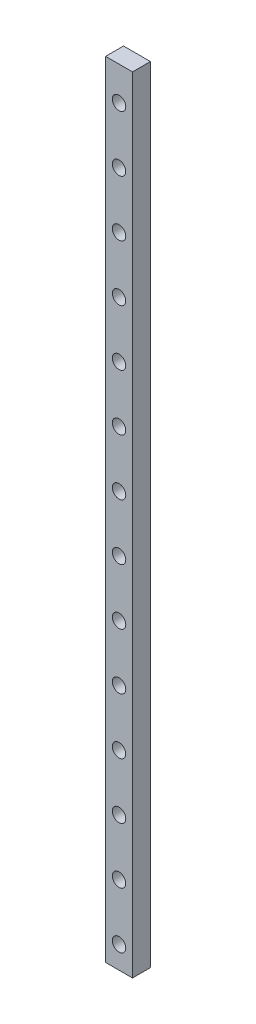
ISO-10303-21;
HEADER;
FILE_DESCRIPTION(('STEP AP214'),'2;1');
FILE_NAME('part.step','',(''),(''),'','','');
FILE_SCHEMA(('AUTOMOTIVE_DESIGN { 1 0 10303 214 1 1 1 1 }'));
ENDSEC;
DATA;
#1=APPLICATION_CONTEXT('core data for automotive mechanical design processes');
#2=APPLICATION_PROTOCOL_DEFINITION('international standard','automotive_design',2000,#1);
#3=PRODUCT_CONTEXT('',#1,'mechanical');
#4=PRODUCT('Part','Part','',(#3));
#5=PRODUCT_RELATED_PRODUCT_CATEGORY('part','',(#4));
#6=PRODUCT_DEFINITION_FORMATION('','',#4);
#7=PRODUCT_DEFINITION_CONTEXT('part definition',#1,'design');
#8=PRODUCT_DEFINITION('design','',#6,#7);
#9=PRODUCT_DEFINITION_SHAPE('','',#8);
#10=(LENGTH_UNIT() NAMED_UNIT(*) SI_UNIT(.MILLI.,.METRE.));
#11=(NAMED_UNIT(*) PLANE_ANGLE_UNIT() SI_UNIT($,.RADIAN.));
#12=(NAMED_UNIT(*) SI_UNIT($,.STERADIAN.) SOLID_ANGLE_UNIT());
#13=UNCERTAINTY_MEASURE_WITH_UNIT(LENGTH_MEASURE(1.E-05),#10,'distance_accuracy_value','');
#14=(GEOMETRIC_REPRESENTATION_CONTEXT(3) GLOBAL_UNCERTAINTY_ASSIGNED_CONTEXT((#13)) GLOBAL_UNIT_ASSIGNED_CONTEXT((#10,
#11,#12)) REPRESENTATION_CONTEXT('',''));
#15=CARTESIAN_POINT('',(0.,0.,0.));
#16=DIRECTION('',(0.,0.,1.));
#17=DIRECTION('',(1.,0.,0.));
#18=AXIS2_PLACEMENT_3D('',#15,#16,#17);
#19=CARTESIAN_POINT('',(-6.,350.,4.));
#20=DIRECTION('',(1.,0.,0.));
#21=DIRECTION('',(0.,0.,-1.));
#22=AXIS2_PLACEMENT_3D('',#19,#20,#21);
#23=PLANE('',#22);
#24=DIRECTION('',(0.,0.,1.));
#25=VECTOR('',#24,1.);
#26=CARTESIAN_POINT('',(-6.,0.,4.));
#27=LINE('',#26,#25);
#28=CARTESIAN_POINT('',(-6.,0.,-4.));
#29=VERTEX_POINT('',#28);
#30=CARTESIAN_POINT('',(-6.,0.,4.));
#31=VERTEX_POINT('',#30);
#32=EDGE_CURVE('E104',#29,#31,#27,.T.);
#33=ORIENTED_EDGE('',*,*,#32,.T.);
#34=DIRECTION('',(0.,-1.,0.));
#35=VECTOR('',#34,1.);
#36=CARTESIAN_POINT('',(-6.,350.,4.));
#37=LINE('',#36,#35);
#38=CARTESIAN_POINT('',(-6.,350.,4.));
#39=VERTEX_POINT('',#38);
#40=EDGE_CURVE('E11',#39,#31,#37,.T.);
#41=ORIENTED_EDGE('',*,*,#40,.F.);
#42=DIRECTION('',(0.,0.,1.));
#43=VECTOR('',#42,1.);
#44=CARTESIAN_POINT('',(-6.,350.,4.));
#45=LINE('',#44,#43);
#46=CARTESIAN_POINT('',(-6.,350.,-4.));
#47=VERTEX_POINT('',#46);
#48=EDGE_CURVE('E91',#47,#39,#45,.T.);
#49=ORIENTED_EDGE('',*,*,#48,.F.);
#50=DIRECTION('',(0.,-1.,0.));
#51=VECTOR('',#50,1.);
#52=CARTESIAN_POINT('',(-6.,350.,-4.));
#53=LINE('',#52,#51);
#54=EDGE_CURVE('E100',#47,#29,#53,.T.);
#55=ORIENTED_EDGE('',*,*,#54,.T.);
#56=EDGE_LOOP('',(#33,#41,#49,#55));
#57=FACE_BOUND('',#56,.T.);
#58=ADVANCED_FACE('F39',(#57),#23,.F.);
#59=CARTESIAN_POINT('',(6.,350.,4.));
#60=DIRECTION('',(0.,0.,-1.));
#61=DIRECTION('',(-1.,0.,0.));
#62=AXIS2_PLACEMENT_3D('',#59,#60,#61);
#63=PLANE('',#62);
#64=CARTESIAN_POINT('',(0.,335.,4.));
#65=DIRECTION('',(0.,0.,1.));
#66=DIRECTION('',(1.,0.,0.));
#67=AXIS2_PLACEMENT_3D('',#64,#65,#66);
#68=CIRCLE('',#67,3.);
#69=CARTESIAN_POINT('',(3.,335.,4.));
#70=VERTEX_POINT('',#69);
#71=EDGE_CURVE('E276',#70,#70,#68,.T.);
#72=ORIENTED_EDGE('',*,*,#71,.F.);
#73=EDGE_LOOP('',(#72));
#74=FACE_BOUND('',#73,.T.);
#75=CARTESIAN_POINT('',(0.,310.,4.));
#76=DIRECTION('',(0.,0.,1.));
#77=DIRECTION('',(1.,0.,0.));
#78=AXIS2_PLACEMENT_3D('',#75,#76,#77);
#79=CIRCLE('',#78,3.);
#80=CARTESIAN_POINT('',(3.,310.,4.));
#81=VERTEX_POINT('',#80);
#82=EDGE_CURVE('E264',#81,#81,#79,.T.);
#83=ORIENTED_EDGE('',*,*,#82,.F.);
#84=EDGE_LOOP('',(#83));
#85=FACE_BOUND('',#84,.T.);
#86=CARTESIAN_POINT('',(0.,285.,4.));
#87=DIRECTION('',(0.,0.,1.));
#88=DIRECTION('',(1.,0.,0.));
#89=AXIS2_PLACEMENT_3D('',#86,#87,#88);
#90=CIRCLE('',#89,3.);
#91=CARTESIAN_POINT('',(3.,285.,4.));
#92=VERTEX_POINT('',#91);
#93=EDGE_CURVE('E252',#92,#92,#90,.T.);
#94=ORIENTED_EDGE('',*,*,#93,.F.);
#95=EDGE_LOOP('',(#94));
#96=FACE_BOUND('',#95,.T.);
#97=CARTESIAN_POINT('',(0.,260.,4.));
#98=DIRECTION('',(0.,0.,1.));
#99=DIRECTION('',(1.,0.,0.));
#100=AXIS2_PLACEMENT_3D('',#97,#98,#99);
#101=CIRCLE('',#100,3.);
#102=CARTESIAN_POINT('',(3.,260.,4.));
#103=VERTEX_POINT('',#102);
#104=EDGE_CURVE('E240',#103,#103,#101,.T.);
#105=ORIENTED_EDGE('',*,*,#104,.F.);
#106=EDGE_LOOP('',(#105));
#107=FACE_BOUND('',#106,.T.);
#108=CARTESIAN_POINT('',(0.,235.,4.));
#109=DIRECTION('',(0.,0.,1.));
#110=DIRECTION('',(1.,0.,0.));
#111=AXIS2_PLACEMENT_3D('',#108,#109,#110);
#112=CIRCLE('',#111,3.);
#113=CARTESIAN_POINT('',(3.,235.,4.));
#114=VERTEX_POINT('',#113);
#115=EDGE_CURVE('E228',#114,#114,#112,.T.);
#116=ORIENTED_EDGE('',*,*,#115,.F.);
#117=EDGE_LOOP('',(#116));
#118=FACE_BOUND('',#117,.T.);
#119=CARTESIAN_POINT('',(0.,210.,4.));
#120=DIRECTION('',(0.,0.,1.));
#121=DIRECTION('',(1.,0.,0.));
#122=AXIS2_PLACEMENT_3D('',#119,#120,#121);
#123=CIRCLE('',#122,3.);
#124=CARTESIAN_POINT('',(3.,210.,4.));
#125=VERTEX_POINT('',#124);
#126=EDGE_CURVE('E216',#125,#125,#123,.T.);
#127=ORIENTED_EDGE('',*,*,#126,.F.);
#128=EDGE_LOOP('',(#127));
#129=FACE_BOUND('',#128,.T.);
#130=CARTESIAN_POINT('',(0.,185.,4.));
#131=DIRECTION('',(0.,0.,1.));
#132=DIRECTION('',(1.,0.,0.));
#133=AXIS2_PLACEMENT_3D('',#130,#131,#132);
#134=CIRCLE('',#133,3.);
#135=CARTESIAN_POINT('',(3.,185.,4.));
#136=VERTEX_POINT('',#135);
#137=EDGE_CURVE('E204',#136,#136,#134,.T.);
#138=ORIENTED_EDGE('',*,*,#137,.F.);
#139=EDGE_LOOP('',(#138));
#140=FACE_BOUND('',#139,.T.);
#141=CARTESIAN_POINT('',(0.,160.,4.));
#142=DIRECTION('',(0.,0.,1.));
#143=DIRECTION('',(1.,0.,0.));
#144=AXIS2_PLACEMENT_3D('',#141,#142,#143);
#145=CIRCLE('',#144,3.);
#146=CARTESIAN_POINT('',(3.,160.,4.));
#147=VERTEX_POINT('',#146);
#148=EDGE_CURVE('E192',#147,#147,#145,.T.);
#149=ORIENTED_EDGE('',*,*,#148,.F.);
#150=EDGE_LOOP('',(#149));
#151=FACE_BOUND('',#150,.T.);
#152=CARTESIAN_POINT('',(0.,135.,4.));
#153=DIRECTION('',(0.,0.,1.));
#154=DIRECTION('',(1.,0.,0.));
#155=AXIS2_PLACEMENT_3D('',#152,#153,#154);
#156=CIRCLE('',#155,3.);
#157=CARTESIAN_POINT('',(3.,135.,4.));
#158=VERTEX_POINT('',#157);
#159=EDGE_CURVE('E180',#158,#158,#156,.T.);
#160=ORIENTED_EDGE('',*,*,#159,.F.);
#161=EDGE_LOOP('',(#160));
#162=FACE_BOUND('',#161,.T.);
#163=CARTESIAN_POINT('',(0.,110.,4.));
#164=DIRECTION('',(0.,0.,1.));
#165=DIRECTION('',(1.,0.,0.));
#166=AXIS2_PLACEMENT_3D('',#163,#164,#165);
#167=CIRCLE('',#166,3.);
#168=CARTESIAN_POINT('',(3.,110.,4.));
#169=VERTEX_POINT('',#168);
#170=EDGE_CURVE('E168',#169,#169,#167,.T.);
#171=ORIENTED_EDGE('',*,*,#170,.F.);
#172=EDGE_LOOP('',(#171));
#173=FACE_BOUND('',#172,.T.);
#174=CARTESIAN_POINT('',(0.,85.,4.));
#175=DIRECTION('',(0.,0.,1.));
#176=DIRECTION('',(1.,0.,0.));
#177=AXIS2_PLACEMENT_3D('',#174,#175,#176);
#178=CIRCLE('',#177,3.);
#179=CARTESIAN_POINT('',(3.,85.,4.));
#180=VERTEX_POINT('',#179);
#181=EDGE_CURVE('E156',#180,#180,#178,.T.);
#182=ORIENTED_EDGE('',*,*,#181,.F.);
#183=EDGE_LOOP('',(#182));
#184=FACE_BOUND('',#183,.T.);
#185=CARTESIAN_POINT('',(0.,60.,4.));
#186=DIRECTION('',(0.,0.,1.));
#187=DIRECTION('',(1.,0.,0.));
#188=AXIS2_PLACEMENT_3D('',#185,#186,#187);
#189=CIRCLE('',#188,3.);
#190=CARTESIAN_POINT('',(3.,60.,4.));
#191=VERTEX_POINT('',#190);
#192=EDGE_CURVE('E144',#191,#191,#189,.T.);
#193=ORIENTED_EDGE('',*,*,#192,.F.);
#194=EDGE_LOOP('',(#193));
#195=FACE_BOUND('',#194,.T.);
#196=CARTESIAN_POINT('',(0.,35.,4.));
#197=DIRECTION('',(0.,0.,1.));
#198=DIRECTION('',(1.,0.,0.));
#199=AXIS2_PLACEMENT_3D('',#196,#197,#198);
#200=CIRCLE('',#199,3.);
#201=CARTESIAN_POINT('',(3.,35.,4.));
#202=VERTEX_POINT('',#201);
#203=EDGE_CURVE('E132',#202,#202,#200,.T.);
#204=ORIENTED_EDGE('',*,*,#203,.F.);
#205=EDGE_LOOP('',(#204));
#206=FACE_BOUND('',#205,.T.);
#207=CARTESIAN_POINT('',(0.,10.,4.));
#208=DIRECTION('',(0.,0.,1.));
#209=DIRECTION('',(1.,0.,0.));
#210=AXIS2_PLACEMENT_3D('',#207,#208,#209);
#211=CIRCLE('',#210,3.);
#212=CARTESIAN_POINT('',(3.,10.,4.));
#213=VERTEX_POINT('',#212);
#214=EDGE_CURVE('E118',#213,#213,#211,.T.);
#215=ORIENTED_EDGE('',*,*,#214,.F.);
#216=EDGE_LOOP('',(#215));
#217=FACE_BOUND('',#216,.T.);
#218=DIRECTION('',(1.,0.,0.));
#219=VECTOR('',#218,1.);
#220=CARTESIAN_POINT('',(6.,0.,4.));
#221=LINE('',#220,#219);
#222=CARTESIAN_POINT('',(6.,0.,4.));
#223=VERTEX_POINT('',#222);
#224=EDGE_CURVE('E95',#31,#223,#221,.T.);
#225=ORIENTED_EDGE('',*,*,#224,.T.);
#226=DIRECTION('',(0.,-1.,0.));
#227=VECTOR('',#226,1.);
#228=CARTESIAN_POINT('',(6.,350.,4.));
#229=LINE('',#228,#227);
#230=CARTESIAN_POINT('',(6.,350.,4.));
#231=VERTEX_POINT('',#230);
#232=EDGE_CURVE('E48',#231,#223,#229,.T.);
#233=ORIENTED_EDGE('',*,*,#232,.F.);
#234=DIRECTION('',(1.,0.,0.));
#235=VECTOR('',#234,1.);
#236=CARTESIAN_POINT('',(6.,350.,4.));
#237=LINE('',#236,#235);
#238=EDGE_CURVE('E86',#39,#231,#237,.T.);
#239=ORIENTED_EDGE('',*,*,#238,.F.);
#240=ORIENTED_EDGE('',*,*,#40,.T.);
#241=EDGE_LOOP('',(#225,#233,#239,#240));
#242=FACE_BOUND('',#241,.T.);
#243=ADVANCED_FACE('F94',(#74,#85,#96,#107,#118,#129,#140,#151,#162,#173,#184,#195,#206,#217,
#242),#63,.F.);
#244=CARTESIAN_POINT('',(6.,350.,4.));
#245=DIRECTION('',(-1.,0.,0.));
#246=DIRECTION('',(0.,0.,1.));
#247=AXIS2_PLACEMENT_3D('',#244,#245,#246);
#248=PLANE('',#247);
#249=DIRECTION('',(0.,0.,-1.));
#250=VECTOR('',#249,1.);
#251=CARTESIAN_POINT('',(6.,0.,4.));
#252=LINE('',#251,#250);
#253=CARTESIAN_POINT('',(6.,0.,-4.));
#254=VERTEX_POINT('',#253);
#255=EDGE_CURVE('E73',#223,#254,#252,.T.);
#256=ORIENTED_EDGE('',*,*,#255,.T.);
#257=DIRECTION('',(0.,-1.,0.));
#258=VECTOR('',#257,1.);
#259=CARTESIAN_POINT('',(6.,350.,-4.));
#260=LINE('',#259,#258);
#261=CARTESIAN_POINT('',(6.,350.,-4.));
#262=VERTEX_POINT('',#261);
#263=EDGE_CURVE('E96',#262,#254,#260,.T.);
#264=ORIENTED_EDGE('',*,*,#263,.F.);
#265=DIRECTION('',(0.,0.,-1.));
#266=VECTOR('',#265,1.);
#267=CARTESIAN_POINT('',(6.,350.,4.));
#268=LINE('',#267,#266);
#269=EDGE_CURVE('E89',#231,#262,#268,.T.);
#270=ORIENTED_EDGE('',*,*,#269,.F.);
#271=ORIENTED_EDGE('',*,*,#232,.T.);
#272=EDGE_LOOP('',(#256,#264,#270,#271));
#273=FACE_BOUND('',#272,.T.);
#274=ADVANCED_FACE('F98',(#273),#248,.F.);
#275=CARTESIAN_POINT('',(6.,350.,-4.));
#276=DIRECTION('',(0.,0.,1.));
#277=DIRECTION('',(1.,0.,0.));
#278=AXIS2_PLACEMENT_3D('',#275,#276,#277);
#279=PLANE('',#278);
#280=CARTESIAN_POINT('',(0.,335.,-4.));
#281=DIRECTION('',(0.,0.,1.));
#282=DIRECTION('',(1.,0.,0.));
#283=AXIS2_PLACEMENT_3D('',#280,#281,#282);
#284=CIRCLE('',#283,1.75);
#285=CARTESIAN_POINT('',(1.75,335.,-4.));
#286=VERTEX_POINT('',#285);
#287=EDGE_CURVE('E279',#286,#286,#284,.T.);
#288=ORIENTED_EDGE('',*,*,#287,.T.);
#289=EDGE_LOOP('',(#288));
#290=FACE_BOUND('',#289,.T.);
#291=CARTESIAN_POINT('',(0.,310.,-4.));
#292=DIRECTION('',(0.,0.,1.));
#293=DIRECTION('',(1.,0.,0.));
#294=AXIS2_PLACEMENT_3D('',#291,#292,#293);
#295=CIRCLE('',#294,1.75);
#296=CARTESIAN_POINT('',(1.75,310.,-4.));
#297=VERTEX_POINT('',#296);
#298=EDGE_CURVE('E267',#297,#297,#295,.T.);
#299=ORIENTED_EDGE('',*,*,#298,.T.);
#300=EDGE_LOOP('',(#299));
#301=FACE_BOUND('',#300,.T.);
#302=CARTESIAN_POINT('',(0.,285.,-4.));
#303=DIRECTION('',(0.,0.,1.));
#304=DIRECTION('',(1.,0.,0.));
#305=AXIS2_PLACEMENT_3D('',#302,#303,#304);
#306=CIRCLE('',#305,1.75);
#307=CARTESIAN_POINT('',(1.75,285.,-4.));
#308=VERTEX_POINT('',#307);
#309=EDGE_CURVE('E255',#308,#308,#306,.T.);
#310=ORIENTED_EDGE('',*,*,#309,.T.);
#311=EDGE_LOOP('',(#310));
#312=FACE_BOUND('',#311,.T.);
#313=CARTESIAN_POINT('',(0.,260.,-4.));
#314=DIRECTION('',(0.,0.,1.));
#315=DIRECTION('',(1.,0.,0.));
#316=AXIS2_PLACEMENT_3D('',#313,#314,#315);
#317=CIRCLE('',#316,1.75);
#318=CARTESIAN_POINT('',(1.75,260.,-4.));
#319=VERTEX_POINT('',#318);
#320=EDGE_CURVE('E243',#319,#319,#317,.T.);
#321=ORIENTED_EDGE('',*,*,#320,.T.);
#322=EDGE_LOOP('',(#321));
#323=FACE_BOUND('',#322,.T.);
#324=CARTESIAN_POINT('',(0.,235.,-4.));
#325=DIRECTION('',(0.,0.,1.));
#326=DIRECTION('',(1.,0.,0.));
#327=AXIS2_PLACEMENT_3D('',#324,#325,#326);
#328=CIRCLE('',#327,1.75);
#329=CARTESIAN_POINT('',(1.75,235.,-4.));
#330=VERTEX_POINT('',#329);
#331=EDGE_CURVE('E231',#330,#330,#328,.T.);
#332=ORIENTED_EDGE('',*,*,#331,.T.);
#333=EDGE_LOOP('',(#332));
#334=FACE_BOUND('',#333,.T.);
#335=CARTESIAN_POINT('',(0.,210.,-4.));
#336=DIRECTION('',(0.,0.,1.));
#337=DIRECTION('',(1.,0.,0.));
#338=AXIS2_PLACEMENT_3D('',#335,#336,#337);
#339=CIRCLE('',#338,1.75);
#340=CARTESIAN_POINT('',(1.75,210.,-4.));
#341=VERTEX_POINT('',#340);
#342=EDGE_CURVE('E219',#341,#341,#339,.T.);
#343=ORIENTED_EDGE('',*,*,#342,.T.);
#344=EDGE_LOOP('',(#343));
#345=FACE_BOUND('',#344,.T.);
#346=CARTESIAN_POINT('',(0.,185.,-4.));
#347=DIRECTION('',(0.,0.,1.));
#348=DIRECTION('',(1.,0.,0.));
#349=AXIS2_PLACEMENT_3D('',#346,#347,#348);
#350=CIRCLE('',#349,1.75);
#351=CARTESIAN_POINT('',(1.75,185.,-4.));
#352=VERTEX_POINT('',#351);
#353=EDGE_CURVE('E207',#352,#352,#350,.T.);
#354=ORIENTED_EDGE('',*,*,#353,.T.);
#355=EDGE_LOOP('',(#354));
#356=FACE_BOUND('',#355,.T.);
#357=CARTESIAN_POINT('',(0.,160.,-4.));
#358=DIRECTION('',(0.,0.,1.));
#359=DIRECTION('',(1.,0.,0.));
#360=AXIS2_PLACEMENT_3D('',#357,#358,#359);
#361=CIRCLE('',#360,1.75);
#362=CARTESIAN_POINT('',(1.75,160.,-4.));
#363=VERTEX_POINT('',#362);
#364=EDGE_CURVE('E195',#363,#363,#361,.T.);
#365=ORIENTED_EDGE('',*,*,#364,.T.);
#366=EDGE_LOOP('',(#365));
#367=FACE_BOUND('',#366,.T.);
#368=CARTESIAN_POINT('',(0.,135.,-4.));
#369=DIRECTION('',(0.,0.,1.));
#370=DIRECTION('',(1.,0.,0.));
#371=AXIS2_PLACEMENT_3D('',#368,#369,#370);
#372=CIRCLE('',#371,1.75);
#373=CARTESIAN_POINT('',(1.75,135.,-4.));
#374=VERTEX_POINT('',#373);
#375=EDGE_CURVE('E183',#374,#374,#372,.T.);
#376=ORIENTED_EDGE('',*,*,#375,.T.);
#377=EDGE_LOOP('',(#376));
#378=FACE_BOUND('',#377,.T.);
#379=CARTESIAN_POINT('',(0.,110.,-4.));
#380=DIRECTION('',(0.,0.,1.));
#381=DIRECTION('',(1.,0.,0.));
#382=AXIS2_PLACEMENT_3D('',#379,#380,#381);
#383=CIRCLE('',#382,1.75);
#384=CARTESIAN_POINT('',(1.75,110.,-4.));
#385=VERTEX_POINT('',#384);
#386=EDGE_CURVE('E171',#385,#385,#383,.T.);
#387=ORIENTED_EDGE('',*,*,#386,.T.);
#388=EDGE_LOOP('',(#387));
#389=FACE_BOUND('',#388,.T.);
#390=CARTESIAN_POINT('',(0.,85.,-4.));
#391=DIRECTION('',(0.,0.,1.));
#392=DIRECTION('',(1.,0.,0.));
#393=AXIS2_PLACEMENT_3D('',#390,#391,#392);
#394=CIRCLE('',#393,1.75);
#395=CARTESIAN_POINT('',(1.75,85.,-4.));
#396=VERTEX_POINT('',#395);
#397=EDGE_CURVE('E159',#396,#396,#394,.T.);
#398=ORIENTED_EDGE('',*,*,#397,.T.);
#399=EDGE_LOOP('',(#398));
#400=FACE_BOUND('',#399,.T.);
#401=CARTESIAN_POINT('',(0.,60.,-4.));
#402=DIRECTION('',(0.,0.,1.));
#403=DIRECTION('',(1.,0.,0.));
#404=AXIS2_PLACEMENT_3D('',#401,#402,#403);
#405=CIRCLE('',#404,1.75);
#406=CARTESIAN_POINT('',(1.75,60.,-4.));
#407=VERTEX_POINT('',#406);
#408=EDGE_CURVE('E147',#407,#407,#405,.T.);
#409=ORIENTED_EDGE('',*,*,#408,.T.);
#410=EDGE_LOOP('',(#409));
#411=FACE_BOUND('',#410,.T.);
#412=CARTESIAN_POINT('',(0.,35.,-4.));
#413=DIRECTION('',(0.,0.,1.));
#414=DIRECTION('',(1.,0.,0.));
#415=AXIS2_PLACEMENT_3D('',#412,#413,#414);
#416=CIRCLE('',#415,1.75);
#417=CARTESIAN_POINT('',(1.75,35.,-4.));
#418=VERTEX_POINT('',#417);
#419=EDGE_CURVE('E135',#418,#418,#416,.T.);
#420=ORIENTED_EDGE('',*,*,#419,.T.);
#421=EDGE_LOOP('',(#420));
#422=FACE_BOUND('',#421,.T.);
#423=CARTESIAN_POINT('',(0.,10.,-4.));
#424=DIRECTION('',(0.,0.,1.));
#425=DIRECTION('',(1.,0.,0.));
#426=AXIS2_PLACEMENT_3D('',#423,#424,#425);
#427=CIRCLE('',#426,1.75);
#428=CARTESIAN_POINT('',(1.75,10.,-4.));
#429=VERTEX_POINT('',#428);
#430=EDGE_CURVE('E42',#429,#429,#427,.T.);
#431=ORIENTED_EDGE('',*,*,#430,.T.);
#432=EDGE_LOOP('',(#431));
#433=FACE_BOUND('',#432,.T.);
#434=DIRECTION('',(-1.,0.,0.));
#435=VECTOR('',#434,1.);
#436=CARTESIAN_POINT('',(6.,0.,-4.));
#437=LINE('',#436,#435);
#438=EDGE_CURVE('E79',#254,#29,#437,.T.);
#439=ORIENTED_EDGE('',*,*,#438,.T.);
#440=ORIENTED_EDGE('',*,*,#54,.F.);
#441=DIRECTION('',(-1.,0.,0.));
#442=VECTOR('',#441,1.);
#443=CARTESIAN_POINT('',(6.,350.,-4.));
#444=LINE('',#443,#442);
#445=EDGE_CURVE('E56',#262,#47,#444,.T.);
#446=ORIENTED_EDGE('',*,*,#445,.F.);
#447=ORIENTED_EDGE('',*,*,#263,.T.);
#448=EDGE_LOOP('',(#439,#440,#446,#447));
#449=FACE_BOUND('',#448,.T.);
#450=ADVANCED_FACE('F112',(#290,#301,#312,#323,#334,#345,#356,#367,#378,#389,#400,#411,#422,
#433,#449),#279,.F.);
#451=CARTESIAN_POINT('',(0.,350.,0.));
#452=DIRECTION('',(0.,1.,0.));
#453=DIRECTION('',(0.,0.,1.));
#454=AXIS2_PLACEMENT_3D('',#451,#452,#453);
#455=PLANE('',#454);
#456=ORIENTED_EDGE('',*,*,#48,.T.);
#457=ORIENTED_EDGE('',*,*,#238,.T.);
#458=ORIENTED_EDGE('',*,*,#269,.T.);
#459=ORIENTED_EDGE('',*,*,#445,.T.);
#460=EDGE_LOOP('',(#456,#457,#458,#459));
#461=FACE_BOUND('',#460,.T.);
#462=ADVANCED_FACE('F87',(#461),#455,.T.);
#463=CARTESIAN_POINT('',(0.,0.,0.));
#464=DIRECTION('',(0.,1.,0.));
#465=DIRECTION('',(0.,0.,1.));
#466=AXIS2_PLACEMENT_3D('',#463,#464,#465);
#467=PLANE('',#466);
#468=ORIENTED_EDGE('',*,*,#32,.F.);
#469=ORIENTED_EDGE('',*,*,#438,.F.);
#470=ORIENTED_EDGE('',*,*,#255,.F.);
#471=ORIENTED_EDGE('',*,*,#224,.F.);
#472=EDGE_LOOP('',(#468,#469,#470,#471));
#473=FACE_BOUND('',#472,.T.);
#474=ADVANCED_FACE('F115',(#473),#467,.F.);
#475=CARTESIAN_POINT('',(0.,10.,-0.499999999999999));
#476=DIRECTION('',(0.,0.,1.));
#477=DIRECTION('',(1.,0.,0.));
#478=AXIS2_PLACEMENT_3D('',#475,#476,#477);
#479=CYLINDRICAL_SURFACE('',#478,3.);
#480=CARTESIAN_POINT('',(0.,10.,-0.499999999999999));
#481=DIRECTION('',(0.,0.,1.));
#482=DIRECTION('',(1.,0.,0.));
#483=AXIS2_PLACEMENT_3D('',#480,#481,#482);
#484=CIRCLE('',#483,3.);
#485=CARTESIAN_POINT('',(3.,10.,-0.499999999999999));
#486=VERTEX_POINT('',#485);
#487=EDGE_CURVE('E107',#486,#486,#484,.T.);
#488=ORIENTED_EDGE('',*,*,#487,.F.);
#489=EDGE_LOOP('',(#488));
#490=FACE_BOUND('',#489,.T.);
#491=ORIENTED_EDGE('',*,*,#214,.T.);
#492=EDGE_LOOP('',(#491));
#493=FACE_BOUND('',#492,.T.);
#494=ADVANCED_FACE('F313',(#490,#493),#479,.F.);
#495=CARTESIAN_POINT('',(0.,10.,-0.499999999999999));
#496=DIRECTION('',(0.,0.,1.));
#497=DIRECTION('',(1.,0.,0.));
#498=AXIS2_PLACEMENT_3D('',#495,#496,#497);
#499=PLANE('',#498);
#500=CARTESIAN_POINT('',(0.,10.,-0.499999999999999));
#501=DIRECTION('',(0.,0.,1.));
#502=DIRECTION('',(1.,0.,0.));
#503=AXIS2_PLACEMENT_3D('',#500,#501,#502);
#504=CIRCLE('',#503,1.75);
#505=CARTESIAN_POINT('',(1.75,10.,-0.499999999999999));
#506=VERTEX_POINT('',#505);
#507=EDGE_CURVE('E123',#506,#506,#504,.T.);
#508=ORIENTED_EDGE('',*,*,#507,.F.);
#509=EDGE_LOOP('',(#508));
#510=FACE_BOUND('',#509,.T.);
#511=ORIENTED_EDGE('',*,*,#487,.T.);
#512=EDGE_LOOP('',(#511));
#513=FACE_BOUND('',#512,.T.);
#514=ADVANCED_FACE('F318',(#510,#513),#499,.T.);
#515=CARTESIAN_POINT('',(0.,10.,-5.));
#516=DIRECTION('',(0.,0.,1.));
#517=DIRECTION('',(1.,0.,0.));
#518=AXIS2_PLACEMENT_3D('',#515,#516,#517);
#519=CYLINDRICAL_SURFACE('',#518,1.75);
#520=ORIENTED_EDGE('',*,*,#507,.T.);
#521=EDGE_LOOP('',(#520));
#522=FACE_BOUND('',#521,.T.);
#523=ORIENTED_EDGE('',*,*,#430,.F.);
#524=EDGE_LOOP('',(#523));
#525=FACE_BOUND('',#524,.T.);
#526=ADVANCED_FACE('F322',(#522,#525),#519,.F.);
#527=CARTESIAN_POINT('',(0.,35.,-0.499999999999999));
#528=DIRECTION('',(0.,0.,1.));
#529=DIRECTION('',(1.,0.,0.));
#530=AXIS2_PLACEMENT_3D('',#527,#528,#529);
#531=CYLINDRICAL_SURFACE('',#530,3.);
#532=CARTESIAN_POINT('',(0.,35.,-0.499999999999999));
#533=DIRECTION('',(0.,0.,1.));
#534=DIRECTION('',(1.,0.,0.));
#535=AXIS2_PLACEMENT_3D('',#532,#533,#534);
#536=CIRCLE('',#535,3.);
#537=CARTESIAN_POINT('',(3.,35.,-0.499999999999999));
#538=VERTEX_POINT('',#537);
#539=EDGE_CURVE('E126',#538,#538,#536,.T.);
#540=ORIENTED_EDGE('',*,*,#539,.F.);
#541=EDGE_LOOP('',(#540));
#542=FACE_BOUND('',#541,.T.);
#543=ORIENTED_EDGE('',*,*,#203,.T.);
#544=EDGE_LOOP('',(#543));
#545=FACE_BOUND('',#544,.T.);
#546=ADVANCED_FACE('F325',(#542,#545),#531,.F.);
#547=CARTESIAN_POINT('',(0.,35.,-0.499999999999999));
#548=DIRECTION('',(0.,0.,1.));
#549=DIRECTION('',(1.,0.,0.));
#550=AXIS2_PLACEMENT_3D('',#547,#548,#549);
#551=PLANE('',#550);
#552=CARTESIAN_POINT('',(0.,35.,-0.499999999999999));
#553=DIRECTION('',(0.,0.,1.));
#554=DIRECTION('',(1.,0.,0.));
#555=AXIS2_PLACEMENT_3D('',#552,#553,#554);
#556=CIRCLE('',#555,1.75);
#557=CARTESIAN_POINT('',(1.75,35.,-0.499999999999999));
#558=VERTEX_POINT('',#557);
#559=EDGE_CURVE('E129',#558,#558,#556,.T.);
#560=ORIENTED_EDGE('',*,*,#559,.F.);
#561=EDGE_LOOP('',(#560));
#562=FACE_BOUND('',#561,.T.);
#563=ORIENTED_EDGE('',*,*,#539,.T.);
#564=EDGE_LOOP('',(#563));
#565=FACE_BOUND('',#564,.T.);
#566=ADVANCED_FACE('F329',(#562,#565),#551,.T.);
#567=CARTESIAN_POINT('',(0.,35.,-5.));
#568=DIRECTION('',(0.,0.,1.));
#569=DIRECTION('',(1.,0.,0.));
#570=AXIS2_PLACEMENT_3D('',#567,#568,#569);
#571=CYLINDRICAL_SURFACE('',#570,1.75);
#572=ORIENTED_EDGE('',*,*,#559,.T.);
#573=EDGE_LOOP('',(#572));
#574=FACE_BOUND('',#573,.T.);
#575=ORIENTED_EDGE('',*,*,#419,.F.);
#576=EDGE_LOOP('',(#575));
#577=FACE_BOUND('',#576,.T.);
#578=ADVANCED_FACE('F333',(#574,#577),#571,.F.);
#579=CARTESIAN_POINT('',(0.,60.,-0.499999999999999));
#580=DIRECTION('',(0.,0.,1.));
#581=DIRECTION('',(1.,0.,0.));
#582=AXIS2_PLACEMENT_3D('',#579,#580,#581);
#583=CYLINDRICAL_SURFACE('',#582,3.);
#584=CARTESIAN_POINT('',(0.,60.,-0.499999999999999));
#585=DIRECTION('',(0.,0.,1.));
#586=DIRECTION('',(1.,0.,0.));
#587=AXIS2_PLACEMENT_3D('',#584,#585,#586);
#588=CIRCLE('',#587,3.);
#589=CARTESIAN_POINT('',(3.,60.,-0.499999999999999));
#590=VERTEX_POINT('',#589);
#591=EDGE_CURVE('E138',#590,#590,#588,.T.);
#592=ORIENTED_EDGE('',*,*,#591,.F.);
#593=EDGE_LOOP('',(#592));
#594=FACE_BOUND('',#593,.T.);
#595=ORIENTED_EDGE('',*,*,#192,.T.);
#596=EDGE_LOOP('',(#595));
#597=FACE_BOUND('',#596,.T.);
#598=ADVANCED_FACE('F337',(#594,#597),#583,.F.);
#599=CARTESIAN_POINT('',(0.,60.,-0.499999999999999));
#600=DIRECTION('',(0.,0.,1.));
#601=DIRECTION('',(1.,0.,0.));
#602=AXIS2_PLACEMENT_3D('',#599,#600,#601);
#603=PLANE('',#602);
#604=CARTESIAN_POINT('',(0.,60.,-0.499999999999999));
#605=DIRECTION('',(0.,0.,1.));
#606=DIRECTION('',(1.,0.,0.));
#607=AXIS2_PLACEMENT_3D('',#604,#605,#606);
#608=CIRCLE('',#607,1.75);
#609=CARTESIAN_POINT('',(1.75,60.,-0.499999999999999));
#610=VERTEX_POINT('',#609);
#611=EDGE_CURVE('E141',#610,#610,#608,.T.);
#612=ORIENTED_EDGE('',*,*,#611,.F.);
#613=EDGE_LOOP('',(#612));
#614=FACE_BOUND('',#613,.T.);
#615=ORIENTED_EDGE('',*,*,#591,.T.);
#616=EDGE_LOOP('',(#615));
#617=FACE_BOUND('',#616,.T.);
#618=ADVANCED_FACE('F341',(#614,#617),#603,.T.);
#619=CARTESIAN_POINT('',(0.,60.,-5.));
#620=DIRECTION('',(0.,0.,1.));
#621=DIRECTION('',(1.,0.,0.));
#622=AXIS2_PLACEMENT_3D('',#619,#620,#621);
#623=CYLINDRICAL_SURFACE('',#622,1.75);
#624=ORIENTED_EDGE('',*,*,#611,.T.);
#625=EDGE_LOOP('',(#624));
#626=FACE_BOUND('',#625,.T.);
#627=ORIENTED_EDGE('',*,*,#408,.F.);
#628=EDGE_LOOP('',(#627));
#629=FACE_BOUND('',#628,.T.);
#630=ADVANCED_FACE('F345',(#626,#629),#623,.F.);
#631=CARTESIAN_POINT('',(0.,85.,-0.499999999999999));
#632=DIRECTION('',(0.,0.,1.));
#633=DIRECTION('',(1.,0.,0.));
#634=AXIS2_PLACEMENT_3D('',#631,#632,#633);
#635=CYLINDRICAL_SURFACE('',#634,3.);
#636=CARTESIAN_POINT('',(0.,85.,-0.499999999999999));
#637=DIRECTION('',(0.,0.,1.));
#638=DIRECTION('',(1.,0.,0.));
#639=AXIS2_PLACEMENT_3D('',#636,#637,#638);
#640=CIRCLE('',#639,3.);
#641=CARTESIAN_POINT('',(3.,85.,-0.499999999999999));
#642=VERTEX_POINT('',#641);
#643=EDGE_CURVE('E150',#642,#642,#640,.T.);
#644=ORIENTED_EDGE('',*,*,#643,.F.);
#645=EDGE_LOOP('',(#644));
#646=FACE_BOUND('',#645,.T.);
#647=ORIENTED_EDGE('',*,*,#181,.T.);
#648=EDGE_LOOP('',(#647));
#649=FACE_BOUND('',#648,.T.);
#650=ADVANCED_FACE('F349',(#646,#649),#635,.F.);
#651=CARTESIAN_POINT('',(0.,85.,-0.499999999999999));
#652=DIRECTION('',(0.,0.,1.));
#653=DIRECTION('',(1.,0.,0.));
#654=AXIS2_PLACEMENT_3D('',#651,#652,#653);
#655=PLANE('',#654);
#656=CARTESIAN_POINT('',(0.,85.,-0.499999999999999));
#657=DIRECTION('',(0.,0.,1.));
#658=DIRECTION('',(1.,0.,0.));
#659=AXIS2_PLACEMENT_3D('',#656,#657,#658);
#660=CIRCLE('',#659,1.75);
#661=CARTESIAN_POINT('',(1.75,85.,-0.499999999999999));
#662=VERTEX_POINT('',#661);
#663=EDGE_CURVE('E153',#662,#662,#660,.T.);
#664=ORIENTED_EDGE('',*,*,#663,.F.);
#665=EDGE_LOOP('',(#664));
#666=FACE_BOUND('',#665,.T.);
#667=ORIENTED_EDGE('',*,*,#643,.T.);
#668=EDGE_LOOP('',(#667));
#669=FACE_BOUND('',#668,.T.);
#670=ADVANCED_FACE('F353',(#666,#669),#655,.T.);
#671=CARTESIAN_POINT('',(0.,85.,-5.));
#672=DIRECTION('',(0.,0.,1.));
#673=DIRECTION('',(1.,0.,0.));
#674=AXIS2_PLACEMENT_3D('',#671,#672,#673);
#675=CYLINDRICAL_SURFACE('',#674,1.75);
#676=ORIENTED_EDGE('',*,*,#663,.T.);
#677=EDGE_LOOP('',(#676));
#678=FACE_BOUND('',#677,.T.);
#679=ORIENTED_EDGE('',*,*,#397,.F.);
#680=EDGE_LOOP('',(#679));
#681=FACE_BOUND('',#680,.T.);
#682=ADVANCED_FACE('F357',(#678,#681),#675,.F.);
#683=CARTESIAN_POINT('',(0.,110.,-0.499999999999999));
#684=DIRECTION('',(0.,0.,1.));
#685=DIRECTION('',(1.,0.,0.));
#686=AXIS2_PLACEMENT_3D('',#683,#684,#685);
#687=CYLINDRICAL_SURFACE('',#686,3.);
#688=CARTESIAN_POINT('',(0.,110.,-0.499999999999999));
#689=DIRECTION('',(0.,0.,1.));
#690=DIRECTION('',(1.,0.,0.));
#691=AXIS2_PLACEMENT_3D('',#688,#689,#690);
#692=CIRCLE('',#691,3.);
#693=CARTESIAN_POINT('',(3.,110.,-0.499999999999999));
#694=VERTEX_POINT('',#693);
#695=EDGE_CURVE('E162',#694,#694,#692,.T.);
#696=ORIENTED_EDGE('',*,*,#695,.F.);
#697=EDGE_LOOP('',(#696));
#698=FACE_BOUND('',#697,.T.);
#699=ORIENTED_EDGE('',*,*,#170,.T.);
#700=EDGE_LOOP('',(#699));
#701=FACE_BOUND('',#700,.T.);
#702=ADVANCED_FACE('F361',(#698,#701),#687,.F.);
#703=CARTESIAN_POINT('',(0.,110.,-0.499999999999999));
#704=DIRECTION('',(0.,0.,1.));
#705=DIRECTION('',(1.,0.,0.));
#706=AXIS2_PLACEMENT_3D('',#703,#704,#705);
#707=PLANE('',#706);
#708=CARTESIAN_POINT('',(0.,110.,-0.499999999999999));
#709=DIRECTION('',(0.,0.,1.));
#710=DIRECTION('',(1.,0.,0.));
#711=AXIS2_PLACEMENT_3D('',#708,#709,#710);
#712=CIRCLE('',#711,1.75);
#713=CARTESIAN_POINT('',(1.75,110.,-0.499999999999999));
#714=VERTEX_POINT('',#713);
#715=EDGE_CURVE('E165',#714,#714,#712,.T.);
#716=ORIENTED_EDGE('',*,*,#715,.F.);
#717=EDGE_LOOP('',(#716));
#718=FACE_BOUND('',#717,.T.);
#719=ORIENTED_EDGE('',*,*,#695,.T.);
#720=EDGE_LOOP('',(#719));
#721=FACE_BOUND('',#720,.T.);
#722=ADVANCED_FACE('F365',(#718,#721),#707,.T.);
#723=CARTESIAN_POINT('',(0.,110.,-5.));
#724=DIRECTION('',(0.,0.,1.));
#725=DIRECTION('',(1.,0.,0.));
#726=AXIS2_PLACEMENT_3D('',#723,#724,#725);
#727=CYLINDRICAL_SURFACE('',#726,1.75);
#728=ORIENTED_EDGE('',*,*,#715,.T.);
#729=EDGE_LOOP('',(#728));
#730=FACE_BOUND('',#729,.T.);
#731=ORIENTED_EDGE('',*,*,#386,.F.);
#732=EDGE_LOOP('',(#731));
#733=FACE_BOUND('',#732,.T.);
#734=ADVANCED_FACE('F369',(#730,#733),#727,.F.);
#735=CARTESIAN_POINT('',(0.,135.,-0.499999999999999));
#736=DIRECTION('',(0.,0.,1.));
#737=DIRECTION('',(1.,0.,0.));
#738=AXIS2_PLACEMENT_3D('',#735,#736,#737);
#739=CYLINDRICAL_SURFACE('',#738,3.);
#740=CARTESIAN_POINT('',(0.,135.,-0.499999999999999));
#741=DIRECTION('',(0.,0.,1.));
#742=DIRECTION('',(1.,0.,0.));
#743=AXIS2_PLACEMENT_3D('',#740,#741,#742);
#744=CIRCLE('',#743,3.);
#745=CARTESIAN_POINT('',(3.,135.,-0.499999999999999));
#746=VERTEX_POINT('',#745);
#747=EDGE_CURVE('E174',#746,#746,#744,.T.);
#748=ORIENTED_EDGE('',*,*,#747,.F.);
#749=EDGE_LOOP('',(#748));
#750=FACE_BOUND('',#749,.T.);
#751=ORIENTED_EDGE('',*,*,#159,.T.);
#752=EDGE_LOOP('',(#751));
#753=FACE_BOUND('',#752,.T.);
#754=ADVANCED_FACE('F373',(#750,#753),#739,.F.);
#755=CARTESIAN_POINT('',(0.,135.,-0.499999999999999));
#756=DIRECTION('',(0.,0.,1.));
#757=DIRECTION('',(1.,0.,0.));
#758=AXIS2_PLACEMENT_3D('',#755,#756,#757);
#759=PLANE('',#758);
#760=CARTESIAN_POINT('',(0.,135.,-0.499999999999999));
#761=DIRECTION('',(0.,0.,1.));
#762=DIRECTION('',(1.,0.,0.));
#763=AXIS2_PLACEMENT_3D('',#760,#761,#762);
#764=CIRCLE('',#763,1.75);
#765=CARTESIAN_POINT('',(1.75,135.,-0.499999999999999));
#766=VERTEX_POINT('',#765);
#767=EDGE_CURVE('E177',#766,#766,#764,.T.);
#768=ORIENTED_EDGE('',*,*,#767,.F.);
#769=EDGE_LOOP('',(#768));
#770=FACE_BOUND('',#769,.T.);
#771=ORIENTED_EDGE('',*,*,#747,.T.);
#772=EDGE_LOOP('',(#771));
#773=FACE_BOUND('',#772,.T.);
#774=ADVANCED_FACE('F377',(#770,#773),#759,.T.);
#775=CARTESIAN_POINT('',(0.,135.,-5.));
#776=DIRECTION('',(0.,0.,1.));
#777=DIRECTION('',(1.,0.,0.));
#778=AXIS2_PLACEMENT_3D('',#775,#776,#777);
#779=CYLINDRICAL_SURFACE('',#778,1.75);
#780=ORIENTED_EDGE('',*,*,#767,.T.);
#781=EDGE_LOOP('',(#780));
#782=FACE_BOUND('',#781,.T.);
#783=ORIENTED_EDGE('',*,*,#375,.F.);
#784=EDGE_LOOP('',(#783));
#785=FACE_BOUND('',#784,.T.);
#786=ADVANCED_FACE('F381',(#782,#785),#779,.F.);
#787=CARTESIAN_POINT('',(0.,160.,-0.499999999999999));
#788=DIRECTION('',(0.,0.,1.));
#789=DIRECTION('',(1.,0.,0.));
#790=AXIS2_PLACEMENT_3D('',#787,#788,#789);
#791=CYLINDRICAL_SURFACE('',#790,3.);
#792=CARTESIAN_POINT('',(0.,160.,-0.499999999999999));
#793=DIRECTION('',(0.,0.,1.));
#794=DIRECTION('',(1.,0.,0.));
#795=AXIS2_PLACEMENT_3D('',#792,#793,#794);
#796=CIRCLE('',#795,3.);
#797=CARTESIAN_POINT('',(3.,160.,-0.499999999999999));
#798=VERTEX_POINT('',#797);
#799=EDGE_CURVE('E186',#798,#798,#796,.T.);
#800=ORIENTED_EDGE('',*,*,#799,.F.);
#801=EDGE_LOOP('',(#800));
#802=FACE_BOUND('',#801,.T.);
#803=ORIENTED_EDGE('',*,*,#148,.T.);
#804=EDGE_LOOP('',(#803));
#805=FACE_BOUND('',#804,.T.);
#806=ADVANCED_FACE('F385',(#802,#805),#791,.F.);
#807=CARTESIAN_POINT('',(0.,160.,-0.499999999999999));
#808=DIRECTION('',(0.,0.,1.));
#809=DIRECTION('',(1.,0.,0.));
#810=AXIS2_PLACEMENT_3D('',#807,#808,#809);
#811=PLANE('',#810);
#812=CARTESIAN_POINT('',(0.,160.,-0.499999999999999));
#813=DIRECTION('',(0.,0.,1.));
#814=DIRECTION('',(1.,0.,0.));
#815=AXIS2_PLACEMENT_3D('',#812,#813,#814);
#816=CIRCLE('',#815,1.75);
#817=CARTESIAN_POINT('',(1.75,160.,-0.499999999999999));
#818=VERTEX_POINT('',#817);
#819=EDGE_CURVE('E189',#818,#818,#816,.T.);
#820=ORIENTED_EDGE('',*,*,#819,.F.);
#821=EDGE_LOOP('',(#820));
#822=FACE_BOUND('',#821,.T.);
#823=ORIENTED_EDGE('',*,*,#799,.T.);
#824=EDGE_LOOP('',(#823));
#825=FACE_BOUND('',#824,.T.);
#826=ADVANCED_FACE('F389',(#822,#825),#811,.T.);
#827=CARTESIAN_POINT('',(0.,160.,-5.));
#828=DIRECTION('',(0.,0.,1.));
#829=DIRECTION('',(1.,0.,0.));
#830=AXIS2_PLACEMENT_3D('',#827,#828,#829);
#831=CYLINDRICAL_SURFACE('',#830,1.75);
#832=ORIENTED_EDGE('',*,*,#819,.T.);
#833=EDGE_LOOP('',(#832));
#834=FACE_BOUND('',#833,.T.);
#835=ORIENTED_EDGE('',*,*,#364,.F.);
#836=EDGE_LOOP('',(#835));
#837=FACE_BOUND('',#836,.T.);
#838=ADVANCED_FACE('F393',(#834,#837),#831,.F.);
#839=CARTESIAN_POINT('',(0.,185.,-0.499999999999999));
#840=DIRECTION('',(0.,0.,1.));
#841=DIRECTION('',(1.,0.,0.));
#842=AXIS2_PLACEMENT_3D('',#839,#840,#841);
#843=CYLINDRICAL_SURFACE('',#842,3.);
#844=CARTESIAN_POINT('',(0.,185.,-0.499999999999999));
#845=DIRECTION('',(0.,0.,1.));
#846=DIRECTION('',(1.,0.,0.));
#847=AXIS2_PLACEMENT_3D('',#844,#845,#846);
#848=CIRCLE('',#847,3.);
#849=CARTESIAN_POINT('',(3.,185.,-0.499999999999999));
#850=VERTEX_POINT('',#849);
#851=EDGE_CURVE('E198',#850,#850,#848,.T.);
#852=ORIENTED_EDGE('',*,*,#851,.F.);
#853=EDGE_LOOP('',(#852));
#854=FACE_BOUND('',#853,.T.);
#855=ORIENTED_EDGE('',*,*,#137,.T.);
#856=EDGE_LOOP('',(#855));
#857=FACE_BOUND('',#856,.T.);
#858=ADVANCED_FACE('F397',(#854,#857),#843,.F.);
#859=CARTESIAN_POINT('',(0.,185.,-0.499999999999999));
#860=DIRECTION('',(0.,0.,1.));
#861=DIRECTION('',(1.,0.,0.));
#862=AXIS2_PLACEMENT_3D('',#859,#860,#861);
#863=PLANE('',#862);
#864=CARTESIAN_POINT('',(0.,185.,-0.499999999999999));
#865=DIRECTION('',(0.,0.,1.));
#866=DIRECTION('',(1.,0.,0.));
#867=AXIS2_PLACEMENT_3D('',#864,#865,#866);
#868=CIRCLE('',#867,1.75);
#869=CARTESIAN_POINT('',(1.75,185.,-0.499999999999999));
#870=VERTEX_POINT('',#869);
#871=EDGE_CURVE('E201',#870,#870,#868,.T.);
#872=ORIENTED_EDGE('',*,*,#871,.F.);
#873=EDGE_LOOP('',(#872));
#874=FACE_BOUND('',#873,.T.);
#875=ORIENTED_EDGE('',*,*,#851,.T.);
#876=EDGE_LOOP('',(#875));
#877=FACE_BOUND('',#876,.T.);
#878=ADVANCED_FACE('F401',(#874,#877),#863,.T.);
#879=CARTESIAN_POINT('',(0.,185.,-5.));
#880=DIRECTION('',(0.,0.,1.));
#881=DIRECTION('',(1.,0.,0.));
#882=AXIS2_PLACEMENT_3D('',#879,#880,#881);
#883=CYLINDRICAL_SURFACE('',#882,1.75);
#884=ORIENTED_EDGE('',*,*,#871,.T.);
#885=EDGE_LOOP('',(#884));
#886=FACE_BOUND('',#885,.T.);
#887=ORIENTED_EDGE('',*,*,#353,.F.);
#888=EDGE_LOOP('',(#887));
#889=FACE_BOUND('',#888,.T.);
#890=ADVANCED_FACE('F405',(#886,#889),#883,.F.);
#891=CARTESIAN_POINT('',(0.,210.,-0.499999999999999));
#892=DIRECTION('',(0.,0.,1.));
#893=DIRECTION('',(1.,0.,0.));
#894=AXIS2_PLACEMENT_3D('',#891,#892,#893);
#895=CYLINDRICAL_SURFACE('',#894,3.);
#896=CARTESIAN_POINT('',(0.,210.,-0.499999999999999));
#897=DIRECTION('',(0.,0.,1.));
#898=DIRECTION('',(1.,0.,0.));
#899=AXIS2_PLACEMENT_3D('',#896,#897,#898);
#900=CIRCLE('',#899,3.);
#901=CARTESIAN_POINT('',(3.,210.,-0.499999999999999));
#902=VERTEX_POINT('',#901);
#903=EDGE_CURVE('E210',#902,#902,#900,.T.);
#904=ORIENTED_EDGE('',*,*,#903,.F.);
#905=EDGE_LOOP('',(#904));
#906=FACE_BOUND('',#905,.T.);
#907=ORIENTED_EDGE('',*,*,#126,.T.);
#908=EDGE_LOOP('',(#907));
#909=FACE_BOUND('',#908,.T.);
#910=ADVANCED_FACE('F409',(#906,#909),#895,.F.);
#911=CARTESIAN_POINT('',(0.,210.,-0.499999999999999));
#912=DIRECTION('',(0.,0.,1.));
#913=DIRECTION('',(1.,0.,0.));
#914=AXIS2_PLACEMENT_3D('',#911,#912,#913);
#915=PLANE('',#914);
#916=CARTESIAN_POINT('',(0.,210.,-0.499999999999999));
#917=DIRECTION('',(0.,0.,1.));
#918=DIRECTION('',(1.,0.,0.));
#919=AXIS2_PLACEMENT_3D('',#916,#917,#918);
#920=CIRCLE('',#919,1.75);
#921=CARTESIAN_POINT('',(1.75,210.,-0.499999999999999));
#922=VERTEX_POINT('',#921);
#923=EDGE_CURVE('E213',#922,#922,#920,.T.);
#924=ORIENTED_EDGE('',*,*,#923,.F.);
#925=EDGE_LOOP('',(#924));
#926=FACE_BOUND('',#925,.T.);
#927=ORIENTED_EDGE('',*,*,#903,.T.);
#928=EDGE_LOOP('',(#927));
#929=FACE_BOUND('',#928,.T.);
#930=ADVANCED_FACE('F413',(#926,#929),#915,.T.);
#931=CARTESIAN_POINT('',(0.,210.,-5.));
#932=DIRECTION('',(0.,0.,1.));
#933=DIRECTION('',(1.,0.,0.));
#934=AXIS2_PLACEMENT_3D('',#931,#932,#933);
#935=CYLINDRICAL_SURFACE('',#934,1.75);
#936=ORIENTED_EDGE('',*,*,#923,.T.);
#937=EDGE_LOOP('',(#936));
#938=FACE_BOUND('',#937,.T.);
#939=ORIENTED_EDGE('',*,*,#342,.F.);
#940=EDGE_LOOP('',(#939));
#941=FACE_BOUND('',#940,.T.);
#942=ADVANCED_FACE('F417',(#938,#941),#935,.F.);
#943=CARTESIAN_POINT('',(0.,235.,-0.499999999999999));
#944=DIRECTION('',(0.,0.,1.));
#945=DIRECTION('',(1.,0.,0.));
#946=AXIS2_PLACEMENT_3D('',#943,#944,#945);
#947=CYLINDRICAL_SURFACE('',#946,3.);
#948=CARTESIAN_POINT('',(0.,235.,-0.499999999999999));
#949=DIRECTION('',(0.,0.,1.));
#950=DIRECTION('',(1.,0.,0.));
#951=AXIS2_PLACEMENT_3D('',#948,#949,#950);
#952=CIRCLE('',#951,3.);
#953=CARTESIAN_POINT('',(3.,235.,-0.499999999999999));
#954=VERTEX_POINT('',#953);
#955=EDGE_CURVE('E222',#954,#954,#952,.T.);
#956=ORIENTED_EDGE('',*,*,#955,.F.);
#957=EDGE_LOOP('',(#956));
#958=FACE_BOUND('',#957,.T.);
#959=ORIENTED_EDGE('',*,*,#115,.T.);
#960=EDGE_LOOP('',(#959));
#961=FACE_BOUND('',#960,.T.);
#962=ADVANCED_FACE('F421',(#958,#961),#947,.F.);
#963=CARTESIAN_POINT('',(0.,235.,-0.499999999999999));
#964=DIRECTION('',(0.,0.,1.));
#965=DIRECTION('',(1.,0.,0.));
#966=AXIS2_PLACEMENT_3D('',#963,#964,#965);
#967=PLANE('',#966);
#968=CARTESIAN_POINT('',(0.,235.,-0.499999999999999));
#969=DIRECTION('',(0.,0.,1.));
#970=DIRECTION('',(1.,0.,0.));
#971=AXIS2_PLACEMENT_3D('',#968,#969,#970);
#972=CIRCLE('',#971,1.75);
#973=CARTESIAN_POINT('',(1.75,235.,-0.499999999999999));
#974=VERTEX_POINT('',#973);
#975=EDGE_CURVE('E225',#974,#974,#972,.T.);
#976=ORIENTED_EDGE('',*,*,#975,.F.);
#977=EDGE_LOOP('',(#976));
#978=FACE_BOUND('',#977,.T.);
#979=ORIENTED_EDGE('',*,*,#955,.T.);
#980=EDGE_LOOP('',(#979));
#981=FACE_BOUND('',#980,.T.);
#982=ADVANCED_FACE('F425',(#978,#981),#967,.T.);
#983=CARTESIAN_POINT('',(0.,235.,-5.));
#984=DIRECTION('',(0.,0.,1.));
#985=DIRECTION('',(1.,0.,0.));
#986=AXIS2_PLACEMENT_3D('',#983,#984,#985);
#987=CYLINDRICAL_SURFACE('',#986,1.75);
#988=ORIENTED_EDGE('',*,*,#975,.T.);
#989=EDGE_LOOP('',(#988));
#990=FACE_BOUND('',#989,.T.);
#991=ORIENTED_EDGE('',*,*,#331,.F.);
#992=EDGE_LOOP('',(#991));
#993=FACE_BOUND('',#992,.T.);
#994=ADVANCED_FACE('F429',(#990,#993),#987,.F.);
#995=CARTESIAN_POINT('',(0.,260.,-0.499999999999999));
#996=DIRECTION('',(0.,0.,1.));
#997=DIRECTION('',(1.,0.,0.));
#998=AXIS2_PLACEMENT_3D('',#995,#996,#997);
#999=CYLINDRICAL_SURFACE('',#998,3.);
#1000=CARTESIAN_POINT('',(0.,260.,-0.499999999999999));
#1001=DIRECTION('',(0.,0.,1.));
#1002=DIRECTION('',(1.,0.,0.));
#1003=AXIS2_PLACEMENT_3D('',#1000,#1001,#1002);
#1004=CIRCLE('',#1003,3.);
#1005=CARTESIAN_POINT('',(3.,260.,-0.499999999999999));
#1006=VERTEX_POINT('',#1005);
#1007=EDGE_CURVE('E234',#1006,#1006,#1004,.T.);
#1008=ORIENTED_EDGE('',*,*,#1007,.F.);
#1009=EDGE_LOOP('',(#1008));
#1010=FACE_BOUND('',#1009,.T.);
#1011=ORIENTED_EDGE('',*,*,#104,.T.);
#1012=EDGE_LOOP('',(#1011));
#1013=FACE_BOUND('',#1012,.T.);
#1014=ADVANCED_FACE('F433',(#1010,#1013),#999,.F.);
#1015=CARTESIAN_POINT('',(0.,260.,-0.499999999999999));
#1016=DIRECTION('',(0.,0.,1.));
#1017=DIRECTION('',(1.,0.,0.));
#1018=AXIS2_PLACEMENT_3D('',#1015,#1016,#1017);
#1019=PLANE('',#1018);
#1020=CARTESIAN_POINT('',(0.,260.,-0.499999999999999));
#1021=DIRECTION('',(0.,0.,1.));
#1022=DIRECTION('',(1.,0.,0.));
#1023=AXIS2_PLACEMENT_3D('',#1020,#1021,#1022);
#1024=CIRCLE('',#1023,1.75);
#1025=CARTESIAN_POINT('',(1.75,260.,-0.499999999999999));
#1026=VERTEX_POINT('',#1025);
#1027=EDGE_CURVE('E237',#1026,#1026,#1024,.T.);
#1028=ORIENTED_EDGE('',*,*,#1027,.F.);
#1029=EDGE_LOOP('',(#1028));
#1030=FACE_BOUND('',#1029,.T.);
#1031=ORIENTED_EDGE('',*,*,#1007,.T.);
#1032=EDGE_LOOP('',(#1031));
#1033=FACE_BOUND('',#1032,.T.);
#1034=ADVANCED_FACE('F437',(#1030,#1033),#1019,.T.);
#1035=CARTESIAN_POINT('',(0.,260.,-5.));
#1036=DIRECTION('',(0.,0.,1.));
#1037=DIRECTION('',(1.,0.,0.));
#1038=AXIS2_PLACEMENT_3D('',#1035,#1036,#1037);
#1039=CYLINDRICAL_SURFACE('',#1038,1.75);
#1040=ORIENTED_EDGE('',*,*,#1027,.T.);
#1041=EDGE_LOOP('',(#1040));
#1042=FACE_BOUND('',#1041,.T.);
#1043=ORIENTED_EDGE('',*,*,#320,.F.);
#1044=EDGE_LOOP('',(#1043));
#1045=FACE_BOUND('',#1044,.T.);
#1046=ADVANCED_FACE('F441',(#1042,#1045),#1039,.F.);
#1047=CARTESIAN_POINT('',(0.,285.,-0.499999999999999));
#1048=DIRECTION('',(0.,0.,1.));
#1049=DIRECTION('',(1.,0.,0.));
#1050=AXIS2_PLACEMENT_3D('',#1047,#1048,#1049);
#1051=CYLINDRICAL_SURFACE('',#1050,3.);
#1052=CARTESIAN_POINT('',(0.,285.,-0.499999999999999));
#1053=DIRECTION('',(0.,0.,1.));
#1054=DIRECTION('',(1.,0.,0.));
#1055=AXIS2_PLACEMENT_3D('',#1052,#1053,#1054);
#1056=CIRCLE('',#1055,3.);
#1057=CARTESIAN_POINT('',(3.,285.,-0.499999999999999));
#1058=VERTEX_POINT('',#1057);
#1059=EDGE_CURVE('E246',#1058,#1058,#1056,.T.);
#1060=ORIENTED_EDGE('',*,*,#1059,.F.);
#1061=EDGE_LOOP('',(#1060));
#1062=FACE_BOUND('',#1061,.T.);
#1063=ORIENTED_EDGE('',*,*,#93,.T.);
#1064=EDGE_LOOP('',(#1063));
#1065=FACE_BOUND('',#1064,.T.);
#1066=ADVANCED_FACE('F445',(#1062,#1065),#1051,.F.);
#1067=CARTESIAN_POINT('',(0.,285.,-0.499999999999999));
#1068=DIRECTION('',(0.,0.,1.));
#1069=DIRECTION('',(1.,0.,0.));
#1070=AXIS2_PLACEMENT_3D('',#1067,#1068,#1069);
#1071=PLANE('',#1070);
#1072=CARTESIAN_POINT('',(0.,285.,-0.499999999999999));
#1073=DIRECTION('',(0.,0.,1.));
#1074=DIRECTION('',(1.,0.,0.));
#1075=AXIS2_PLACEMENT_3D('',#1072,#1073,#1074);
#1076=CIRCLE('',#1075,1.75);
#1077=CARTESIAN_POINT('',(1.75,285.,-0.499999999999999));
#1078=VERTEX_POINT('',#1077);
#1079=EDGE_CURVE('E249',#1078,#1078,#1076,.T.);
#1080=ORIENTED_EDGE('',*,*,#1079,.F.);
#1081=EDGE_LOOP('',(#1080));
#1082=FACE_BOUND('',#1081,.T.);
#1083=ORIENTED_EDGE('',*,*,#1059,.T.);
#1084=EDGE_LOOP('',(#1083));
#1085=FACE_BOUND('',#1084,.T.);
#1086=ADVANCED_FACE('F449',(#1082,#1085),#1071,.T.);
#1087=CARTESIAN_POINT('',(0.,285.,-5.));
#1088=DIRECTION('',(0.,0.,1.));
#1089=DIRECTION('',(1.,0.,0.));
#1090=AXIS2_PLACEMENT_3D('',#1087,#1088,#1089);
#1091=CYLINDRICAL_SURFACE('',#1090,1.75);
#1092=ORIENTED_EDGE('',*,*,#1079,.T.);
#1093=EDGE_LOOP('',(#1092));
#1094=FACE_BOUND('',#1093,.T.);
#1095=ORIENTED_EDGE('',*,*,#309,.F.);
#1096=EDGE_LOOP('',(#1095));
#1097=FACE_BOUND('',#1096,.T.);
#1098=ADVANCED_FACE('F453',(#1094,#1097),#1091,.F.);
#1099=CARTESIAN_POINT('',(0.,310.,-0.499999999999999));
#1100=DIRECTION('',(0.,0.,1.));
#1101=DIRECTION('',(1.,0.,0.));
#1102=AXIS2_PLACEMENT_3D('',#1099,#1100,#1101);
#1103=CYLINDRICAL_SURFACE('',#1102,3.);
#1104=CARTESIAN_POINT('',(0.,310.,-0.499999999999999));
#1105=DIRECTION('',(0.,0.,1.));
#1106=DIRECTION('',(1.,0.,0.));
#1107=AXIS2_PLACEMENT_3D('',#1104,#1105,#1106);
#1108=CIRCLE('',#1107,3.);
#1109=CARTESIAN_POINT('',(3.,310.,-0.499999999999999));
#1110=VERTEX_POINT('',#1109);
#1111=EDGE_CURVE('E258',#1110,#1110,#1108,.T.);
#1112=ORIENTED_EDGE('',*,*,#1111,.F.);
#1113=EDGE_LOOP('',(#1112));
#1114=FACE_BOUND('',#1113,.T.);
#1115=ORIENTED_EDGE('',*,*,#82,.T.);
#1116=EDGE_LOOP('',(#1115));
#1117=FACE_BOUND('',#1116,.T.);
#1118=ADVANCED_FACE('F457',(#1114,#1117),#1103,.F.);
#1119=CARTESIAN_POINT('',(0.,310.,-0.499999999999999));
#1120=DIRECTION('',(0.,0.,1.));
#1121=DIRECTION('',(1.,0.,0.));
#1122=AXIS2_PLACEMENT_3D('',#1119,#1120,#1121);
#1123=PLANE('',#1122);
#1124=CARTESIAN_POINT('',(0.,310.,-0.499999999999999));
#1125=DIRECTION('',(0.,0.,1.));
#1126=DIRECTION('',(1.,0.,0.));
#1127=AXIS2_PLACEMENT_3D('',#1124,#1125,#1126);
#1128=CIRCLE('',#1127,1.75);
#1129=CARTESIAN_POINT('',(1.75,310.,-0.499999999999999));
#1130=VERTEX_POINT('',#1129);
#1131=EDGE_CURVE('E261',#1130,#1130,#1128,.T.);
#1132=ORIENTED_EDGE('',*,*,#1131,.F.);
#1133=EDGE_LOOP('',(#1132));
#1134=FACE_BOUND('',#1133,.T.);
#1135=ORIENTED_EDGE('',*,*,#1111,.T.);
#1136=EDGE_LOOP('',(#1135));
#1137=FACE_BOUND('',#1136,.T.);
#1138=ADVANCED_FACE('F461',(#1134,#1137),#1123,.T.);
#1139=CARTESIAN_POINT('',(0.,310.,-5.));
#1140=DIRECTION('',(0.,0.,1.));
#1141=DIRECTION('',(1.,0.,0.));
#1142=AXIS2_PLACEMENT_3D('',#1139,#1140,#1141);
#1143=CYLINDRICAL_SURFACE('',#1142,1.75);
#1144=ORIENTED_EDGE('',*,*,#1131,.T.);
#1145=EDGE_LOOP('',(#1144));
#1146=FACE_BOUND('',#1145,.T.);
#1147=ORIENTED_EDGE('',*,*,#298,.F.);
#1148=EDGE_LOOP('',(#1147));
#1149=FACE_BOUND('',#1148,.T.);
#1150=ADVANCED_FACE('F465',(#1146,#1149),#1143,.F.);
#1151=CARTESIAN_POINT('',(0.,335.,-0.499999999999999));
#1152=DIRECTION('',(0.,0.,1.));
#1153=DIRECTION('',(1.,0.,0.));
#1154=AXIS2_PLACEMENT_3D('',#1151,#1152,#1153);
#1155=CYLINDRICAL_SURFACE('',#1154,3.);
#1156=CARTESIAN_POINT('',(0.,335.,-0.499999999999999));
#1157=DIRECTION('',(0.,0.,1.));
#1158=DIRECTION('',(1.,0.,0.));
#1159=AXIS2_PLACEMENT_3D('',#1156,#1157,#1158);
#1160=CIRCLE('',#1159,3.);
#1161=CARTESIAN_POINT('',(3.,335.,-0.499999999999999));
#1162=VERTEX_POINT('',#1161);
#1163=EDGE_CURVE('E270',#1162,#1162,#1160,.T.);
#1164=ORIENTED_EDGE('',*,*,#1163,.F.);
#1165=EDGE_LOOP('',(#1164));
#1166=FACE_BOUND('',#1165,.T.);
#1167=ORIENTED_EDGE('',*,*,#71,.T.);
#1168=EDGE_LOOP('',(#1167));
#1169=FACE_BOUND('',#1168,.T.);
#1170=ADVANCED_FACE('F293',(#1166,#1169),#1155,.F.);
#1171=CARTESIAN_POINT('',(0.,335.,-0.499999999999999));
#1172=DIRECTION('',(0.,0.,1.));
#1173=DIRECTION('',(1.,0.,0.));
#1174=AXIS2_PLACEMENT_3D('',#1171,#1172,#1173);
#1175=PLANE('',#1174);
#1176=CARTESIAN_POINT('',(0.,335.,-0.499999999999999));
#1177=DIRECTION('',(0.,0.,1.));
#1178=DIRECTION('',(1.,0.,0.));
#1179=AXIS2_PLACEMENT_3D('',#1176,#1177,#1178);
#1180=CIRCLE('',#1179,1.75);
#1181=CARTESIAN_POINT('',(1.75,335.,-0.499999999999999));
#1182=VERTEX_POINT('',#1181);
#1183=EDGE_CURVE('E273',#1182,#1182,#1180,.T.);
#1184=ORIENTED_EDGE('',*,*,#1183,.F.);
#1185=EDGE_LOOP('',(#1184));
#1186=FACE_BOUND('',#1185,.T.);
#1187=ORIENTED_EDGE('',*,*,#1163,.T.);
#1188=EDGE_LOOP('',(#1187));
#1189=FACE_BOUND('',#1188,.T.);
#1190=ADVANCED_FACE('F287',(#1186,#1189),#1175,.T.);
#1191=CARTESIAN_POINT('',(0.,335.,-5.));
#1192=DIRECTION('',(0.,0.,1.));
#1193=DIRECTION('',(1.,0.,0.));
#1194=AXIS2_PLACEMENT_3D('',#1191,#1192,#1193);
#1195=CYLINDRICAL_SURFACE('',#1194,1.75);
#1196=ORIENTED_EDGE('',*,*,#1183,.T.);
#1197=EDGE_LOOP('',(#1196));
#1198=FACE_BOUND('',#1197,.T.);
#1199=ORIENTED_EDGE('',*,*,#287,.F.);
#1200=EDGE_LOOP('',(#1199));
#1201=FACE_BOUND('',#1200,.T.);
#1202=ADVANCED_FACE('F285',(#1198,#1201),#1195,.F.);
#1203=CLOSED_SHELL('',(#58,#243,#274,#450,#462,#474,#494,#514,#526,#546,#566,#578,#598,#618,
#630,#650,#670,#682,#702,#722,#734,#754,#774,#786,#806,#826,#838,#858,#878,#890,#910,#930,#942,
#962,#982,#994,#1014,#1034,#1046,#1066,#1086,#1098,#1118,#1138,#1150,#1170,#1190,#1202));
#1204=MANIFOLD_SOLID_BREP('B2',#1203);
#1205=ADVANCED_BREP_SHAPE_REPRESENTATION('',(#18,#1204),#14);
#1206=SHAPE_DEFINITION_REPRESENTATION(#9,#1205);
ENDSEC;
END-ISO-10303-21;
